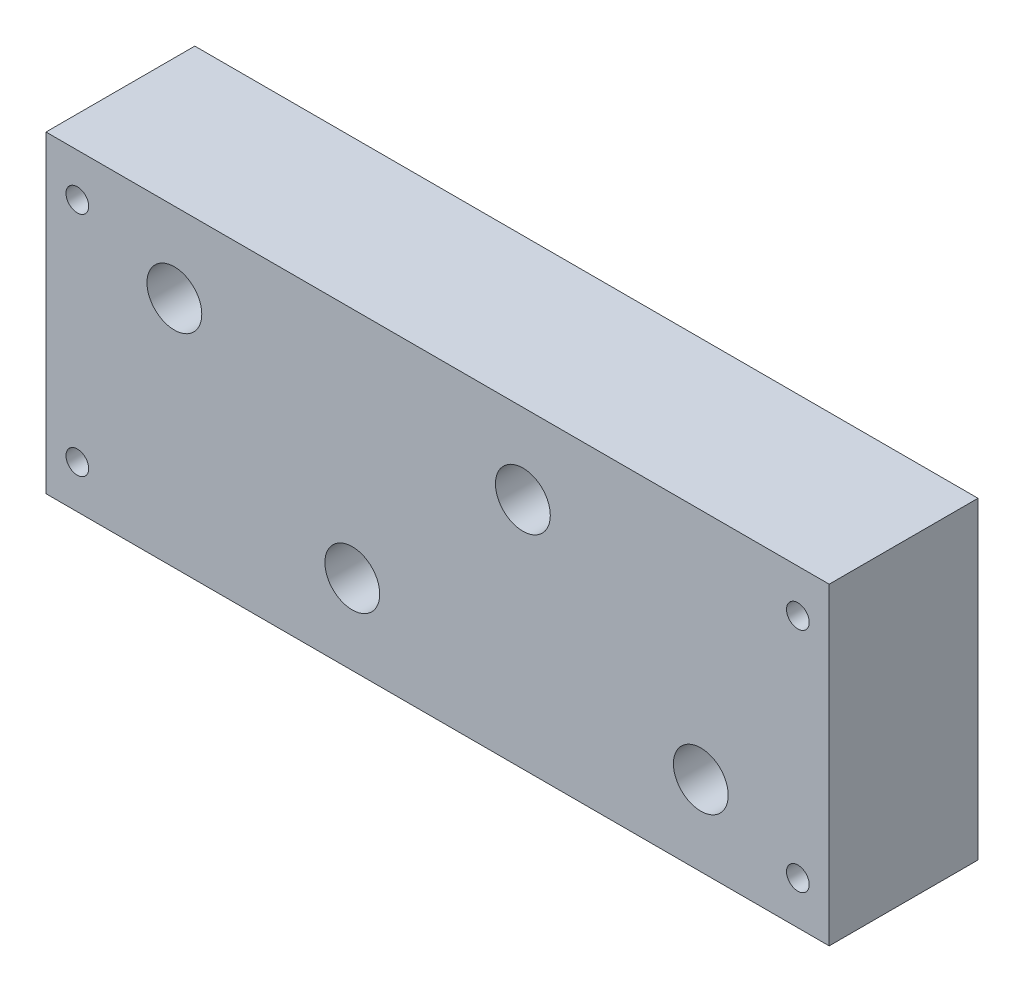
ISO-10303-21;
HEADER;
FILE_DESCRIPTION(('STEP AP214'),'2;1');
FILE_NAME('part.step','',(''),(''),'','','');
FILE_SCHEMA(('AUTOMOTIVE_DESIGN { 1 0 10303 214 1 1 1 1 }'));
ENDSEC;
DATA;
#1=APPLICATION_CONTEXT('core data for automotive mechanical design processes');
#2=APPLICATION_PROTOCOL_DEFINITION('international standard','automotive_design',2000,#1);
#3=PRODUCT_CONTEXT('',#1,'mechanical');
#4=PRODUCT('Part','Part','',(#3));
#5=PRODUCT_RELATED_PRODUCT_CATEGORY('part','',(#4));
#6=PRODUCT_DEFINITION_FORMATION('','',#4);
#7=PRODUCT_DEFINITION_CONTEXT('part definition',#1,'design');
#8=PRODUCT_DEFINITION('design','',#6,#7);
#9=PRODUCT_DEFINITION_SHAPE('','',#8);
#10=(LENGTH_UNIT() NAMED_UNIT(*) SI_UNIT(.MILLI.,.METRE.));
#11=(NAMED_UNIT(*) PLANE_ANGLE_UNIT() SI_UNIT($,.RADIAN.));
#12=(NAMED_UNIT(*) SI_UNIT($,.STERADIAN.) SOLID_ANGLE_UNIT());
#13=UNCERTAINTY_MEASURE_WITH_UNIT(LENGTH_MEASURE(1.E-05),#10,'distance_accuracy_value','');
#14=(GEOMETRIC_REPRESENTATION_CONTEXT(3) GLOBAL_UNCERTAINTY_ASSIGNED_CONTEXT((#13)) GLOBAL_UNIT_ASSIGNED_CONTEXT((#10,
#11,#12)) REPRESENTATION_CONTEXT('',''));
#15=CARTESIAN_POINT('',(0.,0.,0.));
#16=DIRECTION('',(0.,0.,1.));
#17=DIRECTION('',(1.,0.,0.));
#18=AXIS2_PLACEMENT_3D('',#15,#16,#17);
#19=CARTESIAN_POINT('',(13.75,18.5625,33.));
#20=DIRECTION('',(1.,0.,0.));
#21=DIRECTION('',(0.,1.,0.));
#22=AXIS2_PLACEMENT_3D('',#19,#20,#21);
#23=PLANE('',#22);
#24=DIRECTION('',(0.,-1.,0.));
#25=VECTOR('',#24,1.);
#26=CARTESIAN_POINT('',(13.75,18.5625,19.));
#27=LINE('',#26,#25);
#28=CARTESIAN_POINT('',(13.75,18.0625,19.));
#29=VERTEX_POINT('',#28);
#30=CARTESIAN_POINT('',(13.75,-14.9375,19.));
#31=VERTEX_POINT('',#30);
#32=EDGE_CURVE('E342',#29,#31,#27,.T.);
#33=ORIENTED_EDGE('',*,*,#32,.T.);
#34=DIRECTION('',(0.,0.,-1.));
#35=VECTOR('',#34,1.);
#36=CARTESIAN_POINT('',(13.75,-14.9375,33.));
#37=LINE('',#36,#35);
#38=CARTESIAN_POINT('',(13.75,-14.9375,33.));
#39=VERTEX_POINT('',#38);
#40=EDGE_CURVE('E211',#31,#39,#37,.F.);
#41=ORIENTED_EDGE('',*,*,#40,.T.);
#42=DIRECTION('',(0.,-1.,0.));
#43=VECTOR('',#42,1.);
#44=CARTESIAN_POINT('',(13.75,18.5625,33.));
#45=LINE('',#44,#43);
#46=CARTESIAN_POINT('',(13.75,18.0625,33.));
#47=VERTEX_POINT('',#46);
#48=EDGE_CURVE('E307',#47,#39,#45,.T.);
#49=ORIENTED_EDGE('',*,*,#48,.F.);
#50=DIRECTION('',(0.,0.,-1.));
#51=VECTOR('',#50,1.);
#52=CARTESIAN_POINT('',(13.75,18.0625,19.));
#53=LINE('',#52,#51);
#54=EDGE_CURVE('E208',#47,#29,#53,.T.);
#55=ORIENTED_EDGE('',*,*,#54,.T.);
#56=EDGE_LOOP('',(#33,#41,#49,#55));
#57=FACE_BOUND('',#56,.T.);
#58=ADVANCED_FACE('F33',(#57),#23,.F.);
#59=CARTESIAN_POINT('',(13.75,18.5625,33.));
#60=DIRECTION('',(0.,1.,0.));
#61=DIRECTION('',(0.,0.,1.));
#62=AXIS2_PLACEMENT_3D('',#59,#60,#61);
#63=PLANE('',#62);
#64=DIRECTION('',(1.,0.,0.));
#65=VECTOR('',#64,1.);
#66=CARTESIAN_POINT('',(13.75,18.5625,19.));
#67=LINE('',#66,#65);
#68=CARTESIAN_POINT('',(-25.25,18.5625,19.));
#69=VERTEX_POINT('',#68);
#70=CARTESIAN_POINT('',(13.25,18.5625,19.));
#71=VERTEX_POINT('',#70);
#72=EDGE_CURVE('E336',#69,#71,#67,.T.);
#73=ORIENTED_EDGE('',*,*,#72,.T.);
#74=DIRECTION('',(0.,0.,-1.));
#75=VECTOR('',#74,1.);
#76=CARTESIAN_POINT('',(13.25,18.5625,33.));
#77=LINE('',#76,#75);
#78=CARTESIAN_POINT('',(13.25,18.5625,33.));
#79=VERTEX_POINT('',#78);
#80=EDGE_CURVE('E224',#71,#79,#77,.F.);
#81=ORIENTED_EDGE('',*,*,#80,.T.);
#82=DIRECTION('',(1.,0.,0.));
#83=VECTOR('',#82,1.);
#84=CARTESIAN_POINT('',(13.75,18.5625,33.));
#85=LINE('',#84,#83);
#86=CARTESIAN_POINT('',(-25.25,18.5625,33.));
#87=VERTEX_POINT('',#86);
#88=EDGE_CURVE('E300',#87,#79,#85,.T.);
#89=ORIENTED_EDGE('',*,*,#88,.F.);
#90=DIRECTION('',(0.,0.,-1.));
#91=VECTOR('',#90,1.);
#92=CARTESIAN_POINT('',(-25.25,18.5625,19.));
#93=LINE('',#92,#91);
#94=EDGE_CURVE('E221',#87,#69,#93,.T.);
#95=ORIENTED_EDGE('',*,*,#94,.T.);
#96=EDGE_LOOP('',(#73,#81,#89,#95));
#97=FACE_BOUND('',#96,.T.);
#98=ADVANCED_FACE('F393',(#97),#63,.F.);
#99=CARTESIAN_POINT('',(-25.75,18.5625,33.));
#100=DIRECTION('',(-1.,0.,0.));
#101=DIRECTION('',(0.,-1.,0.));
#102=AXIS2_PLACEMENT_3D('',#99,#100,#101);
#103=PLANE('',#102);
#104=DIRECTION('',(0.,1.,0.));
#105=VECTOR('',#104,1.);
#106=CARTESIAN_POINT('',(-25.75,18.5625,19.));
#107=LINE('',#106,#105);
#108=CARTESIAN_POINT('',(-25.75,-14.9375,19.));
#109=VERTEX_POINT('',#108);
#110=CARTESIAN_POINT('',(-25.75,18.0625,19.));
#111=VERTEX_POINT('',#110);
#112=EDGE_CURVE('E333',#109,#111,#107,.T.);
#113=ORIENTED_EDGE('',*,*,#112,.T.);
#114=DIRECTION('',(0.,0.,-1.));
#115=VECTOR('',#114,1.);
#116=CARTESIAN_POINT('',(-25.75,18.0625,33.));
#117=LINE('',#116,#115);
#118=CARTESIAN_POINT('',(-25.75,18.0625,33.));
#119=VERTEX_POINT('',#118);
#120=EDGE_CURVE('E229',#111,#119,#117,.F.);
#121=ORIENTED_EDGE('',*,*,#120,.T.);
#122=DIRECTION('',(0.,1.,0.));
#123=VECTOR('',#122,1.);
#124=CARTESIAN_POINT('',(-25.75,18.5625,33.));
#125=LINE('',#124,#123);
#126=CARTESIAN_POINT('',(-25.75,-14.9375,33.));
#127=VERTEX_POINT('',#126);
#128=EDGE_CURVE('E314',#127,#119,#125,.T.);
#129=ORIENTED_EDGE('',*,*,#128,.F.);
#130=DIRECTION('',(0.,0.,-1.));
#131=VECTOR('',#130,1.);
#132=CARTESIAN_POINT('',(-25.75,-14.9375,19.));
#133=LINE('',#132,#131);
#134=EDGE_CURVE('E226',#127,#109,#133,.T.);
#135=ORIENTED_EDGE('',*,*,#134,.T.);
#136=EDGE_LOOP('',(#113,#121,#129,#135));
#137=FACE_BOUND('',#136,.T.);
#138=ADVANCED_FACE('F399',(#137),#103,.F.);
#139=CARTESIAN_POINT('',(13.75,-15.4375,33.));
#140=DIRECTION('',(0.,-1.,0.));
#141=DIRECTION('',(0.,0.,-1.));
#142=AXIS2_PLACEMENT_3D('',#139,#140,#141);
#143=PLANE('',#142);
#144=DIRECTION('',(-1.,0.,0.));
#145=VECTOR('',#144,1.);
#146=CARTESIAN_POINT('',(13.75,-15.4375,33.));
#147=LINE('',#146,#145);
#148=CARTESIAN_POINT('',(13.25,-15.4375,33.));
#149=VERTEX_POINT('',#148);
#150=CARTESIAN_POINT('',(-25.25,-15.4375,33.));
#151=VERTEX_POINT('',#150);
#152=EDGE_CURVE('E310',#149,#151,#147,.T.);
#153=ORIENTED_EDGE('',*,*,#152,.F.);
#154=DIRECTION('',(0.,0.,-1.));
#155=VECTOR('',#154,1.);
#156=CARTESIAN_POINT('',(13.25,-15.4375,19.));
#157=LINE('',#156,#155);
#158=CARTESIAN_POINT('',(13.25,-15.4375,19.));
#159=VERTEX_POINT('',#158);
#160=EDGE_CURVE('E205',#149,#159,#157,.T.);
#161=ORIENTED_EDGE('',*,*,#160,.T.);
#162=DIRECTION('',(-1.,0.,0.));
#163=VECTOR('',#162,1.);
#164=CARTESIAN_POINT('',(13.75,-15.4375,19.));
#165=LINE('',#164,#163);
#166=CARTESIAN_POINT('',(-25.25,-15.4375,19.));
#167=VERTEX_POINT('',#166);
#168=EDGE_CURVE('E194',#159,#167,#165,.T.);
#169=ORIENTED_EDGE('',*,*,#168,.T.);
#170=DIRECTION('',(0.,0.,-1.));
#171=VECTOR('',#170,1.);
#172=CARTESIAN_POINT('',(-25.25,-15.4375,33.));
#173=LINE('',#172,#171);
#174=EDGE_CURVE('E198',#167,#151,#173,.F.);
#175=ORIENTED_EDGE('',*,*,#174,.T.);
#176=EDGE_LOOP('',(#153,#161,#169,#175));
#177=FACE_BOUND('',#176,.T.);
#178=ADVANCED_FACE('F403',(#177),#143,.F.);
#179=CARTESIAN_POINT('',(0.,0.,33.));
#180=DIRECTION('',(0.,0.,-1.));
#181=DIRECTION('',(-1.,0.,0.));
#182=AXIS2_PLACEMENT_3D('',#179,#180,#181);
#183=PLANE('',#182);
#184=CARTESIAN_POINT('',(5.36038806849447,-8.23247743403263,33.));
#185=DIRECTION('',(0.,0.,-1.));
#186=DIRECTION('',(-1.,0.,0.));
#187=AXIS2_PLACEMENT_3D('',#184,#185,#186);
#188=CIRCLE('',#187,3.5);
#189=CARTESIAN_POINT('',(1.86038806849447,-8.23247743403263,33.));
#190=VERTEX_POINT('',#189);
#191=EDGE_CURVE('E646',#190,#190,#188,.T.);
#192=ORIENTED_EDGE('',*,*,#191,.F.);
#193=EDGE_LOOP('',(#192));
#194=FACE_BOUND('',#193,.T.);
#195=CARTESIAN_POINT('',(-17.3603880684945,11.3574774340326,33.));
#196=DIRECTION('',(0.,0.,-1.));
#197=DIRECTION('',(-1.,0.,0.));
#198=AXIS2_PLACEMENT_3D('',#195,#196,#197);
#199=CIRCLE('',#198,3.50000000000001);
#200=CARTESIAN_POINT('',(-20.8603880684945,11.3574774340326,33.));
#201=VERTEX_POINT('',#200);
#202=EDGE_CURVE('E652',#201,#201,#199,.T.);
#203=ORIENTED_EDGE('',*,*,#202,.F.);
#204=EDGE_LOOP('',(#203));
#205=FACE_BOUND('',#204,.T.);
#206=ORIENTED_EDGE('',*,*,#48,.T.);
#207=CARTESIAN_POINT('',(13.25,-14.9375,33.));
#208=DIRECTION('',(0.,0.,-1.));
#209=DIRECTION('',(-1.,0.,0.));
#210=AXIS2_PLACEMENT_3D('',#207,#208,#209);
#211=CIRCLE('',#210,0.5);
#212=EDGE_CURVE('E219',#39,#149,#211,.T.);
#213=ORIENTED_EDGE('',*,*,#212,.T.);
#214=ORIENTED_EDGE('',*,*,#152,.T.);
#215=CARTESIAN_POINT('',(-25.25,-14.9375,33.));
#216=DIRECTION('',(0.,0.,-1.));
#217=DIRECTION('',(-1.,0.,0.));
#218=AXIS2_PLACEMENT_3D('',#215,#216,#217);
#219=CIRCLE('',#218,0.5);
#220=EDGE_CURVE('E213',#151,#127,#219,.T.);
#221=ORIENTED_EDGE('',*,*,#220,.T.);
#222=ORIENTED_EDGE('',*,*,#128,.T.);
#223=CARTESIAN_POINT('',(-25.25,18.0625,33.));
#224=DIRECTION('',(0.,0.,-1.));
#225=DIRECTION('',(-1.,0.,0.));
#226=AXIS2_PLACEMENT_3D('',#223,#224,#225);
#227=CIRCLE('',#226,0.5);
#228=EDGE_CURVE('E215',#119,#87,#227,.T.);
#229=ORIENTED_EDGE('',*,*,#228,.T.);
#230=ORIENTED_EDGE('',*,*,#88,.T.);
#231=CARTESIAN_POINT('',(13.25,18.0625,33.));
#232=DIRECTION('',(0.,0.,-1.));
#233=DIRECTION('',(-1.,0.,0.));
#234=AXIS2_PLACEMENT_3D('',#231,#232,#233);
#235=CIRCLE('',#234,0.5);
#236=EDGE_CURVE('E217',#79,#47,#235,.T.);
#237=ORIENTED_EDGE('',*,*,#236,.T.);
#238=EDGE_LOOP('',(#206,#213,#214,#221,#222,#229,#230,#237));
#239=FACE_BOUND('',#238,.T.);
#240=ADVANCED_FACE('F473',(#194,#205,#239),#183,.T.);
#241=CARTESIAN_POINT('',(66.25,-18.4375,19.));
#242=DIRECTION('',(0.,0.,1.));
#243=DIRECTION('',(1.,0.,0.));
#244=AXIS2_PLACEMENT_3D('',#241,#242,#243);
#245=PLANE('',#244);
#246=CARTESIAN_POINT('',(-29.75,-12.9375,19.));
#247=DIRECTION('',(0.,0.,1.));
#248=DIRECTION('',(1.,0.,0.));
#249=AXIS2_PLACEMENT_3D('',#246,#247,#248);
#250=CIRCLE('',#249,1.45);
#251=CARTESIAN_POINT('',(-28.3,-12.9375,19.));
#252=VERTEX_POINT('',#251);
#253=EDGE_CURVE('E356',#252,#252,#250,.F.);
#254=ORIENTED_EDGE('',*,*,#253,.F.);
#255=EDGE_LOOP('',(#254));
#256=FACE_BOUND('',#255,.T.);
#257=CARTESIAN_POINT('',(62.25,-12.9375,19.));
#258=DIRECTION('',(0.,0.,1.));
#259=DIRECTION('',(1.,0.,0.));
#260=AXIS2_PLACEMENT_3D('',#257,#258,#259);
#261=CIRCLE('',#260,1.45);
#262=CARTESIAN_POINT('',(63.7,-12.9375,19.));
#263=VERTEX_POINT('',#262);
#264=EDGE_CURVE('E280',#263,#263,#261,.F.);
#265=ORIENTED_EDGE('',*,*,#264,.F.);
#266=EDGE_LOOP('',(#265));
#267=FACE_BOUND('',#266,.T.);
#268=DIRECTION('',(1.,0.,0.));
#269=VECTOR('',#268,1.);
#270=CARTESIAN_POINT('',(66.25,21.5625,19.));
#271=LINE('',#270,#269);
#272=CARTESIAN_POINT('',(-33.75,21.5625,19.));
#273=VERTEX_POINT('',#272);
#274=CARTESIAN_POINT('',(66.25,21.5625,19.));
#275=VERTEX_POINT('',#274);
#276=EDGE_CURVE('E180',#273,#275,#271,.T.);
#277=ORIENTED_EDGE('',*,*,#276,.T.);
#278=DIRECTION('',(0.,1.,0.));
#279=VECTOR('',#278,1.);
#280=CARTESIAN_POINT('',(66.25,-18.4375,19.));
#281=LINE('',#280,#279);
#282=CARTESIAN_POINT('',(66.25,-18.4375,19.));
#283=VERTEX_POINT('',#282);
#284=EDGE_CURVE('E175',#283,#275,#281,.T.);
#285=ORIENTED_EDGE('',*,*,#284,.F.);
#286=DIRECTION('',(1.,0.,0.));
#287=VECTOR('',#286,1.);
#288=CARTESIAN_POINT('',(66.25,-18.4375,19.));
#289=LINE('',#288,#287);
#290=CARTESIAN_POINT('',(-33.75,-18.4375,19.));
#291=VERTEX_POINT('',#290);
#292=EDGE_CURVE('E168',#291,#283,#289,.T.);
#293=ORIENTED_EDGE('',*,*,#292,.F.);
#294=DIRECTION('',(0.,1.,0.));
#295=VECTOR('',#294,1.);
#296=CARTESIAN_POINT('',(-33.75,-18.4375,19.));
#297=LINE('',#296,#295);
#298=EDGE_CURVE('E172',#291,#273,#297,.T.);
#299=ORIENTED_EDGE('',*,*,#298,.T.);
#300=EDGE_LOOP('',(#277,#285,#293,#299));
#301=FACE_BOUND('',#300,.T.);
#302=ORIENTED_EDGE('',*,*,#72,.F.);
#303=CARTESIAN_POINT('',(-25.25,18.0625,19.));
#304=DIRECTION('',(0.,0.,1.));
#305=DIRECTION('',(1.,0.,0.));
#306=AXIS2_PLACEMENT_3D('',#303,#304,#305);
#307=CIRCLE('',#306,0.5);
#308=EDGE_CURVE('E262',#69,#111,#307,.T.);
#309=ORIENTED_EDGE('',*,*,#308,.T.);
#310=ORIENTED_EDGE('',*,*,#112,.F.);
#311=CARTESIAN_POINT('',(-25.25,-14.9375,19.));
#312=DIRECTION('',(0.,0.,1.));
#313=DIRECTION('',(1.,0.,0.));
#314=AXIS2_PLACEMENT_3D('',#311,#312,#313);
#315=CIRCLE('',#314,0.5);
#316=EDGE_CURVE('E264',#109,#167,#315,.T.);
#317=ORIENTED_EDGE('',*,*,#316,.T.);
#318=ORIENTED_EDGE('',*,*,#168,.F.);
#319=CARTESIAN_POINT('',(13.25,-14.9375,19.));
#320=DIRECTION('',(0.,0.,1.));
#321=DIRECTION('',(1.,0.,0.));
#322=AXIS2_PLACEMENT_3D('',#319,#320,#321);
#323=CIRCLE('',#322,0.5);
#324=EDGE_CURVE('E258',#159,#31,#323,.T.);
#325=ORIENTED_EDGE('',*,*,#324,.T.);
#326=ORIENTED_EDGE('',*,*,#32,.F.);
#327=CARTESIAN_POINT('',(13.25,18.0625,19.));
#328=DIRECTION('',(0.,0.,1.));
#329=DIRECTION('',(1.,0.,0.));
#330=AXIS2_PLACEMENT_3D('',#327,#328,#329);
#331=CIRCLE('',#330,0.5);
#332=EDGE_CURVE('E260',#29,#71,#331,.T.);
#333=ORIENTED_EDGE('',*,*,#332,.T.);
#334=EDGE_LOOP('',(#302,#309,#310,#317,#318,#325,#326,#333));
#335=FACE_BOUND('',#334,.T.);
#336=DIRECTION('',(1.,0.,0.));
#337=VECTOR('',#336,1.);
#338=CARTESIAN_POINT('',(58.25,18.5625,19.));
#339=LINE('',#338,#337);
#340=CARTESIAN_POINT('',(19.25,18.5625,19.));
#341=VERTEX_POINT('',#340);
#342=CARTESIAN_POINT('',(57.75,18.5625,19.));
#343=VERTEX_POINT('',#342);
#344=EDGE_CURVE('E281',#341,#343,#339,.T.);
#345=ORIENTED_EDGE('',*,*,#344,.F.);
#346=CARTESIAN_POINT('',(19.25,18.0625,19.));
#347=DIRECTION('',(0.,0.,1.));
#348=DIRECTION('',(1.,0.,0.));
#349=AXIS2_PLACEMENT_3D('',#346,#347,#348);
#350=CIRCLE('',#349,0.5);
#351=CARTESIAN_POINT('',(18.75,18.0625,19.));
#352=VERTEX_POINT('',#351);
#353=EDGE_CURVE('E266',#341,#352,#350,.T.);
#354=ORIENTED_EDGE('',*,*,#353,.T.);
#355=DIRECTION('',(0.,1.,0.));
#356=VECTOR('',#355,1.);
#357=CARTESIAN_POINT('',(18.75,18.5625,19.));
#358=LINE('',#357,#356);
#359=CARTESIAN_POINT('',(18.75,-14.9375,19.));
#360=VERTEX_POINT('',#359);
#361=EDGE_CURVE('E346',#360,#352,#358,.T.);
#362=ORIENTED_EDGE('',*,*,#361,.F.);
#363=CARTESIAN_POINT('',(19.25,-14.9375,19.));
#364=DIRECTION('',(0.,0.,1.));
#365=DIRECTION('',(1.,0.,0.));
#366=AXIS2_PLACEMENT_3D('',#363,#364,#365);
#367=CIRCLE('',#366,0.5);
#368=CARTESIAN_POINT('',(19.25,-15.4375,19.));
#369=VERTEX_POINT('',#368);
#370=EDGE_CURVE('E11',#360,#369,#367,.T.);
#371=ORIENTED_EDGE('',*,*,#370,.T.);
#372=DIRECTION('',(-1.,0.,0.));
#373=VECTOR('',#372,1.);
#374=CARTESIAN_POINT('',(58.25,-15.4375,19.));
#375=LINE('',#374,#373);
#376=CARTESIAN_POINT('',(57.75,-15.4375,19.));
#377=VERTEX_POINT('',#376);
#378=EDGE_CURVE('E274',#377,#369,#375,.T.);
#379=ORIENTED_EDGE('',*,*,#378,.F.);
#380=CARTESIAN_POINT('',(57.75,-14.9375,19.));
#381=DIRECTION('',(0.,0.,1.));
#382=DIRECTION('',(1.,0.,0.));
#383=AXIS2_PLACEMENT_3D('',#380,#381,#382);
#384=CIRCLE('',#383,0.5);
#385=CARTESIAN_POINT('',(58.25,-14.9375,19.));
#386=VERTEX_POINT('',#385);
#387=EDGE_CURVE('E41',#377,#386,#384,.T.);
#388=ORIENTED_EDGE('',*,*,#387,.T.);
#389=DIRECTION('',(0.,-1.,0.));
#390=VECTOR('',#389,1.);
#391=CARTESIAN_POINT('',(58.25,18.5625,19.));
#392=LINE('',#391,#390);
#393=CARTESIAN_POINT('',(58.25,18.0625,19.));
#394=VERTEX_POINT('',#393);
#395=EDGE_CURVE('E273',#394,#386,#392,.T.);
#396=ORIENTED_EDGE('',*,*,#395,.F.);
#397=CARTESIAN_POINT('',(57.75,18.0625,19.));
#398=DIRECTION('',(0.,0.,1.));
#399=DIRECTION('',(1.,0.,0.));
#400=AXIS2_PLACEMENT_3D('',#397,#398,#399);
#401=CIRCLE('',#400,0.5);
#402=EDGE_CURVE('E268',#394,#343,#401,.T.);
#403=ORIENTED_EDGE('',*,*,#402,.T.);
#404=EDGE_LOOP('',(#345,#354,#362,#371,#379,#388,#396,#403));
#405=FACE_BOUND('',#404,.T.);
#406=CARTESIAN_POINT('',(-29.75,16.0625,19.));
#407=DIRECTION('',(0.,0.,1.));
#408=DIRECTION('',(1.,0.,0.));
#409=AXIS2_PLACEMENT_3D('',#406,#407,#408);
#410=CIRCLE('',#409,1.45);
#411=CARTESIAN_POINT('',(-28.3,16.0625,19.));
#412=VERTEX_POINT('',#411);
#413=EDGE_CURVE('E353',#412,#412,#410,.F.);
#414=ORIENTED_EDGE('',*,*,#413,.F.);
#415=EDGE_LOOP('',(#414));
#416=FACE_BOUND('',#415,.T.);
#417=CARTESIAN_POINT('',(62.25,16.0625,19.));
#418=DIRECTION('',(0.,0.,1.));
#419=DIRECTION('',(1.,0.,0.));
#420=AXIS2_PLACEMENT_3D('',#417,#418,#419);
#421=CIRCLE('',#420,1.45);
#422=CARTESIAN_POINT('',(63.7,16.0625,19.));
#423=VERTEX_POINT('',#422);
#424=EDGE_CURVE('E359',#423,#423,#421,.F.);
#425=ORIENTED_EDGE('',*,*,#424,.F.);
#426=EDGE_LOOP('',(#425));
#427=FACE_BOUND('',#426,.T.);
#428=ADVANCED_FACE('F170',(#256,#267,#301,#335,#405,#416,#427),#245,.F.);
#429=CARTESIAN_POINT('',(58.25,18.5625,33.));
#430=DIRECTION('',(1.,0.,0.));
#431=DIRECTION('',(0.,1.,0.));
#432=AXIS2_PLACEMENT_3D('',#429,#430,#431);
#433=PLANE('',#432);
#434=DIRECTION('',(0.,-1.,0.));
#435=VECTOR('',#434,1.);
#436=CARTESIAN_POINT('',(58.25,18.5625,33.));
#437=LINE('',#436,#435);
#438=CARTESIAN_POINT('',(58.25,18.0625,33.));
#439=VERTEX_POINT('',#438);
#440=CARTESIAN_POINT('',(58.25,-14.9375,33.));
#441=VERTEX_POINT('',#440);
#442=EDGE_CURVE('E292',#439,#441,#437,.T.);
#443=ORIENTED_EDGE('',*,*,#442,.F.);
#444=DIRECTION('',(0.,0.,-1.));
#445=VECTOR('',#444,1.);
#446=CARTESIAN_POINT('',(58.25,18.0625,19.));
#447=LINE('',#446,#445);
#448=EDGE_CURVE('E251',#439,#394,#447,.T.);
#449=ORIENTED_EDGE('',*,*,#448,.T.);
#450=ORIENTED_EDGE('',*,*,#395,.T.);
#451=DIRECTION('',(0.,0.,-1.));
#452=VECTOR('',#451,1.);
#453=CARTESIAN_POINT('',(58.25,-14.9375,33.));
#454=LINE('',#453,#452);
#455=EDGE_CURVE('E249',#386,#441,#454,.F.);
#456=ORIENTED_EDGE('',*,*,#455,.T.);
#457=EDGE_LOOP('',(#443,#449,#450,#456));
#458=FACE_BOUND('',#457,.T.);
#459=ADVANCED_FACE('F277',(#458),#433,.F.);
#460=CARTESIAN_POINT('',(58.25,18.5625,33.));
#461=DIRECTION('',(0.,1.,0.));
#462=DIRECTION('',(0.,0.,1.));
#463=AXIS2_PLACEMENT_3D('',#460,#461,#462);
#464=PLANE('',#463);
#465=DIRECTION('',(1.,0.,0.));
#466=VECTOR('',#465,1.);
#467=CARTESIAN_POINT('',(58.25,18.5625,33.));
#468=LINE('',#467,#466);
#469=CARTESIAN_POINT('',(19.25,18.5625,33.));
#470=VERTEX_POINT('',#469);
#471=CARTESIAN_POINT('',(57.75,18.5625,33.));
#472=VERTEX_POINT('',#471);
#473=EDGE_CURVE('E298',#470,#472,#468,.T.);
#474=ORIENTED_EDGE('',*,*,#473,.F.);
#475=DIRECTION('',(0.,0.,-1.));
#476=VECTOR('',#475,1.);
#477=CARTESIAN_POINT('',(19.25,18.5625,19.));
#478=LINE('',#477,#476);
#479=EDGE_CURVE('E233',#470,#341,#478,.T.);
#480=ORIENTED_EDGE('',*,*,#479,.T.);
#481=ORIENTED_EDGE('',*,*,#344,.T.);
#482=DIRECTION('',(0.,0.,-1.));
#483=VECTOR('',#482,1.);
#484=CARTESIAN_POINT('',(57.75,18.5625,33.));
#485=LINE('',#484,#483);
#486=EDGE_CURVE('E231',#343,#472,#485,.F.);
#487=ORIENTED_EDGE('',*,*,#486,.T.);
#488=EDGE_LOOP('',(#474,#480,#481,#487));
#489=FACE_BOUND('',#488,.T.);
#490=ADVANCED_FACE('F460',(#489),#464,.F.);
#491=CARTESIAN_POINT('',(18.75,18.5625,33.));
#492=DIRECTION('',(-1.,0.,0.));
#493=DIRECTION('',(0.,-1.,0.));
#494=AXIS2_PLACEMENT_3D('',#491,#492,#493);
#495=PLANE('',#494);
#496=ORIENTED_EDGE('',*,*,#361,.T.);
#497=DIRECTION('',(0.,0.,-1.));
#498=VECTOR('',#497,1.);
#499=CARTESIAN_POINT('',(18.75,18.0625,33.));
#500=LINE('',#499,#498);
#501=CARTESIAN_POINT('',(18.75,18.0625,33.));
#502=VERTEX_POINT('',#501);
#503=EDGE_CURVE('E239',#352,#502,#500,.F.);
#504=ORIENTED_EDGE('',*,*,#503,.T.);
#505=DIRECTION('',(0.,1.,0.));
#506=VECTOR('',#505,1.);
#507=CARTESIAN_POINT('',(18.75,18.5625,33.));
#508=LINE('',#507,#506);
#509=CARTESIAN_POINT('',(18.75,-14.9375,33.));
#510=VERTEX_POINT('',#509);
#511=EDGE_CURVE('E296',#510,#502,#508,.T.);
#512=ORIENTED_EDGE('',*,*,#511,.F.);
#513=DIRECTION('',(0.,0.,-1.));
#514=VECTOR('',#513,1.);
#515=CARTESIAN_POINT('',(18.75,-14.9375,19.));
#516=LINE('',#515,#514);
#517=EDGE_CURVE('E236',#510,#360,#516,.T.);
#518=ORIENTED_EDGE('',*,*,#517,.T.);
#519=EDGE_LOOP('',(#496,#504,#512,#518));
#520=FACE_BOUND('',#519,.T.);
#521=ADVANCED_FACE('F454',(#520),#495,.F.);
#522=CARTESIAN_POINT('',(58.25,-15.4375,33.));
#523=DIRECTION('',(0.,-1.,0.));
#524=DIRECTION('',(0.,0.,-1.));
#525=AXIS2_PLACEMENT_3D('',#522,#523,#524);
#526=PLANE('',#525);
#527=DIRECTION('',(-1.,0.,0.));
#528=VECTOR('',#527,1.);
#529=CARTESIAN_POINT('',(58.25,-15.4375,33.));
#530=LINE('',#529,#528);
#531=CARTESIAN_POINT('',(57.75,-15.4375,33.));
#532=VERTEX_POINT('',#531);
#533=CARTESIAN_POINT('',(19.25,-15.4375,33.));
#534=VERTEX_POINT('',#533);
#535=EDGE_CURVE('E290',#532,#534,#530,.T.);
#536=ORIENTED_EDGE('',*,*,#535,.F.);
#537=DIRECTION('',(0.,0.,-1.));
#538=VECTOR('',#537,1.);
#539=CARTESIAN_POINT('',(57.75,-15.4375,19.));
#540=LINE('',#539,#538);
#541=EDGE_CURVE('E256',#532,#377,#540,.T.);
#542=ORIENTED_EDGE('',*,*,#541,.T.);
#543=ORIENTED_EDGE('',*,*,#378,.T.);
#544=DIRECTION('',(0.,0.,-1.));
#545=VECTOR('',#544,1.);
#546=CARTESIAN_POINT('',(19.25,-15.4375,33.));
#547=LINE('',#546,#545);
#548=EDGE_CURVE('E254',#369,#534,#547,.F.);
#549=ORIENTED_EDGE('',*,*,#548,.T.);
#550=EDGE_LOOP('',(#536,#542,#543,#549));
#551=FACE_BOUND('',#550,.T.);
#552=ADVANCED_FACE('F294',(#551),#526,.F.);
#553=CARTESIAN_POINT('',(0.,0.,33.));
#554=DIRECTION('',(0.,0.,-1.));
#555=DIRECTION('',(-1.,0.,0.));
#556=AXIS2_PLACEMENT_3D('',#553,#554,#555);
#557=PLANE('',#556);
#558=CARTESIAN_POINT('',(49.8603880684945,-8.23247743403263,33.));
#559=DIRECTION('',(0.,0.,-1.));
#560=DIRECTION('',(-1.,0.,0.));
#561=AXIS2_PLACEMENT_3D('',#558,#559,#560);
#562=CIRCLE('',#561,3.5);
#563=CARTESIAN_POINT('',(46.3603880684945,-8.23247743403263,33.));
#564=VERTEX_POINT('',#563);
#565=EDGE_CURVE('E636',#564,#564,#562,.T.);
#566=ORIENTED_EDGE('',*,*,#565,.F.);
#567=EDGE_LOOP('',(#566));
#568=FACE_BOUND('',#567,.T.);
#569=CARTESIAN_POINT('',(27.1396119315055,11.3574774340326,33.));
#570=DIRECTION('',(0.,0.,-1.));
#571=DIRECTION('',(-1.,0.,0.));
#572=AXIS2_PLACEMENT_3D('',#569,#570,#571);
#573=CIRCLE('',#572,3.5);
#574=CARTESIAN_POINT('',(23.6396119315055,11.3574774340326,33.));
#575=VERTEX_POINT('',#574);
#576=EDGE_CURVE('E638',#575,#575,#573,.T.);
#577=ORIENTED_EDGE('',*,*,#576,.F.);
#578=EDGE_LOOP('',(#577));
#579=FACE_BOUND('',#578,.T.);
#580=ORIENTED_EDGE('',*,*,#511,.T.);
#581=CARTESIAN_POINT('',(19.25,18.0625,33.));
#582=DIRECTION('',(0.,0.,-1.));
#583=DIRECTION('',(-1.,0.,0.));
#584=AXIS2_PLACEMENT_3D('',#581,#582,#583);
#585=CIRCLE('',#584,0.5);
#586=EDGE_CURVE('E247',#502,#470,#585,.T.);
#587=ORIENTED_EDGE('',*,*,#586,.T.);
#588=ORIENTED_EDGE('',*,*,#473,.T.);
#589=CARTESIAN_POINT('',(57.75,18.0625,33.));
#590=DIRECTION('',(0.,0.,-1.));
#591=DIRECTION('',(-1.,0.,0.));
#592=AXIS2_PLACEMENT_3D('',#589,#590,#591);
#593=CIRCLE('',#592,0.5);
#594=EDGE_CURVE('E245',#472,#439,#593,.T.);
#595=ORIENTED_EDGE('',*,*,#594,.T.);
#596=ORIENTED_EDGE('',*,*,#442,.T.);
#597=CARTESIAN_POINT('',(57.75,-14.9375,33.));
#598=DIRECTION('',(0.,0.,-1.));
#599=DIRECTION('',(-1.,0.,0.));
#600=AXIS2_PLACEMENT_3D('',#597,#598,#599);
#601=CIRCLE('',#600,0.5);
#602=EDGE_CURVE('E243',#441,#532,#601,.T.);
#603=ORIENTED_EDGE('',*,*,#602,.T.);
#604=ORIENTED_EDGE('',*,*,#535,.T.);
#605=CARTESIAN_POINT('',(19.25,-14.9375,33.));
#606=DIRECTION('',(0.,0.,-1.));
#607=DIRECTION('',(-1.,0.,0.));
#608=AXIS2_PLACEMENT_3D('',#605,#606,#607);
#609=CIRCLE('',#608,0.5);
#610=EDGE_CURVE('E241',#534,#510,#609,.T.);
#611=ORIENTED_EDGE('',*,*,#610,.T.);
#612=EDGE_LOOP('',(#580,#587,#588,#595,#596,#603,#604,#611));
#613=FACE_BOUND('',#612,.T.);
#614=ADVANCED_FACE('F289',(#568,#579,#613),#557,.T.);
#615=CARTESIAN_POINT('',(-33.75,21.5625,38.));
#616=DIRECTION('',(1.,0.,0.));
#617=DIRECTION('',(0.,0.,-1.));
#618=AXIS2_PLACEMENT_3D('',#615,#616,#617);
#619=PLANE('',#618);
#620=DIRECTION('',(0.,0.,-1.));
#621=VECTOR('',#620,1.);
#622=CARTESIAN_POINT('',(-33.75,21.5625,38.));
#623=LINE('',#622,#621);
#624=CARTESIAN_POINT('',(-33.75,21.5625,38.));
#625=VERTEX_POINT('',#624);
#626=EDGE_CURVE('E189',#625,#273,#623,.T.);
#627=ORIENTED_EDGE('',*,*,#626,.T.);
#628=ORIENTED_EDGE('',*,*,#298,.F.);
#629=DIRECTION('',(0.,0.,-1.));
#630=VECTOR('',#629,1.);
#631=CARTESIAN_POINT('',(-33.75,-18.4375,38.));
#632=LINE('',#631,#630);
#633=CARTESIAN_POINT('',(-33.75,-18.4375,38.));
#634=VERTEX_POINT('',#633);
#635=EDGE_CURVE('E187',#634,#291,#632,.T.);
#636=ORIENTED_EDGE('',*,*,#635,.F.);
#637=DIRECTION('',(0.,-1.,0.));
#638=VECTOR('',#637,1.);
#639=CARTESIAN_POINT('',(-33.75,21.5625,38.));
#640=LINE('',#639,#638);
#641=EDGE_CURVE('E306',#625,#634,#640,.T.);
#642=ORIENTED_EDGE('',*,*,#641,.F.);
#643=EDGE_LOOP('',(#627,#628,#636,#642));
#644=FACE_BOUND('',#643,.T.);
#645=ADVANCED_FACE('F185',(#644),#619,.F.);
#646=CARTESIAN_POINT('',(-33.75,-18.4375,38.));
#647=DIRECTION('',(0.,1.,0.));
#648=DIRECTION('',(0.,0.,1.));
#649=AXIS2_PLACEMENT_3D('',#646,#647,#648);
#650=PLANE('',#649);
#651=ORIENTED_EDGE('',*,*,#635,.T.);
#652=ORIENTED_EDGE('',*,*,#292,.T.);
#653=DIRECTION('',(0.,0.,-1.));
#654=VECTOR('',#653,1.);
#655=CARTESIAN_POINT('',(66.25,-18.4375,38.));
#656=LINE('',#655,#654);
#657=CARTESIAN_POINT('',(66.25,-18.4375,38.));
#658=VERTEX_POINT('',#657);
#659=EDGE_CURVE('E195',#658,#283,#656,.T.);
#660=ORIENTED_EDGE('',*,*,#659,.F.);
#661=DIRECTION('',(1.,0.,0.));
#662=VECTOR('',#661,1.);
#663=CARTESIAN_POINT('',(-33.75,-18.4375,38.));
#664=LINE('',#663,#662);
#665=EDGE_CURVE('E192',#634,#658,#664,.T.);
#666=ORIENTED_EDGE('',*,*,#665,.F.);
#667=EDGE_LOOP('',(#651,#652,#660,#666));
#668=FACE_BOUND('',#667,.T.);
#669=ADVANCED_FACE('F191',(#668),#650,.F.);
#670=CARTESIAN_POINT('',(66.25,21.5625,38.));
#671=DIRECTION('',(-1.,0.,0.));
#672=DIRECTION('',(0.,0.,1.));
#673=AXIS2_PLACEMENT_3D('',#670,#671,#672);
#674=PLANE('',#673);
#675=ORIENTED_EDGE('',*,*,#659,.T.);
#676=ORIENTED_EDGE('',*,*,#284,.T.);
#677=DIRECTION('',(0.,0.,-1.));
#678=VECTOR('',#677,1.);
#679=CARTESIAN_POINT('',(66.25,21.5625,38.));
#680=LINE('',#679,#678);
#681=CARTESIAN_POINT('',(66.25,21.5625,38.));
#682=VERTEX_POINT('',#681);
#683=EDGE_CURVE('E200',#682,#275,#680,.T.);
#684=ORIENTED_EDGE('',*,*,#683,.F.);
#685=DIRECTION('',(0.,1.,0.));
#686=VECTOR('',#685,1.);
#687=CARTESIAN_POINT('',(66.25,21.5625,38.));
#688=LINE('',#687,#686);
#689=EDGE_CURVE('E321',#658,#682,#688,.T.);
#690=ORIENTED_EDGE('',*,*,#689,.F.);
#691=EDGE_LOOP('',(#675,#676,#684,#690));
#692=FACE_BOUND('',#691,.T.);
#693=ADVANCED_FACE('F332',(#692),#674,.F.);
#694=CARTESIAN_POINT('',(-33.75,21.5625,38.));
#695=DIRECTION('',(0.,-1.,0.));
#696=DIRECTION('',(0.,0.,-1.));
#697=AXIS2_PLACEMENT_3D('',#694,#695,#696);
#698=PLANE('',#697);
#699=ORIENTED_EDGE('',*,*,#683,.T.);
#700=ORIENTED_EDGE('',*,*,#276,.F.);
#701=ORIENTED_EDGE('',*,*,#626,.F.);
#702=DIRECTION('',(-1.,0.,0.));
#703=VECTOR('',#702,1.);
#704=CARTESIAN_POINT('',(-33.75,21.5625,38.));
#705=LINE('',#704,#703);
#706=EDGE_CURVE('E323',#682,#625,#705,.T.);
#707=ORIENTED_EDGE('',*,*,#706,.F.);
#708=EDGE_LOOP('',(#699,#700,#701,#707));
#709=FACE_BOUND('',#708,.T.);
#710=ADVANCED_FACE('F329',(#709),#698,.F.);
#711=CARTESIAN_POINT('',(0.,0.,38.));
#712=DIRECTION('',(0.,0.,1.));
#713=DIRECTION('',(1.,0.,0.));
#714=AXIS2_PLACEMENT_3D('',#711,#712,#713);
#715=PLANE('',#714);
#716=CARTESIAN_POINT('',(49.8603880684945,-8.23247743403263,38.));
#717=DIRECTION('',(0.,0.,1.));
#718=DIRECTION('',(1.,0.,0.));
#719=AXIS2_PLACEMENT_3D('',#716,#717,#718);
#720=CIRCLE('',#719,3.5);
#721=CARTESIAN_POINT('',(53.3603880684945,-8.23247743403263,38.));
#722=VERTEX_POINT('',#721);
#723=EDGE_CURVE('E633',#722,#722,#720,.F.);
#724=ORIENTED_EDGE('',*,*,#723,.T.);
#725=EDGE_LOOP('',(#724));
#726=FACE_BOUND('',#725,.T.);
#727=CARTESIAN_POINT('',(27.1396119315055,11.3574774340326,38.));
#728=DIRECTION('',(0.,0.,1.));
#729=DIRECTION('',(1.,0.,0.));
#730=AXIS2_PLACEMENT_3D('',#727,#728,#729);
#731=CIRCLE('',#730,3.5);
#732=CARTESIAN_POINT('',(30.6396119315055,11.3574774340326,38.));
#733=VERTEX_POINT('',#732);
#734=EDGE_CURVE('E643',#733,#733,#731,.F.);
#735=ORIENTED_EDGE('',*,*,#734,.T.);
#736=EDGE_LOOP('',(#735));
#737=FACE_BOUND('',#736,.T.);
#738=CARTESIAN_POINT('',(5.36038806849447,-8.23247743403263,38.));
#739=DIRECTION('',(0.,0.,1.));
#740=DIRECTION('',(1.,0.,0.));
#741=AXIS2_PLACEMENT_3D('',#738,#739,#740);
#742=CIRCLE('',#741,3.5);
#743=CARTESIAN_POINT('',(8.86038806849447,-8.23247743403263,38.));
#744=VERTEX_POINT('',#743);
#745=EDGE_CURVE('E649',#744,#744,#742,.F.);
#746=ORIENTED_EDGE('',*,*,#745,.T.);
#747=EDGE_LOOP('',(#746));
#748=FACE_BOUND('',#747,.T.);
#749=CARTESIAN_POINT('',(-17.3603880684945,11.3574774340326,38.));
#750=DIRECTION('',(0.,0.,1.));
#751=DIRECTION('',(1.,0.,0.));
#752=AXIS2_PLACEMENT_3D('',#749,#750,#751);
#753=CIRCLE('',#752,3.50000000000001);
#754=CARTESIAN_POINT('',(-13.8603880684945,11.3574774340326,38.));
#755=VERTEX_POINT('',#754);
#756=EDGE_CURVE('E655',#755,#755,#753,.F.);
#757=ORIENTED_EDGE('',*,*,#756,.T.);
#758=EDGE_LOOP('',(#757));
#759=FACE_BOUND('',#758,.T.);
#760=CARTESIAN_POINT('',(62.25,-12.9375,38.));
#761=DIRECTION('',(0.,0.,1.));
#762=DIRECTION('',(1.,0.,0.));
#763=AXIS2_PLACEMENT_3D('',#760,#761,#762);
#764=CIRCLE('',#763,1.45);
#765=CARTESIAN_POINT('',(63.7,-12.9375,38.));
#766=VERTEX_POINT('',#765);
#767=EDGE_CURVE('E366',#766,#766,#764,.F.);
#768=ORIENTED_EDGE('',*,*,#767,.T.);
#769=EDGE_LOOP('',(#768));
#770=FACE_BOUND('',#769,.T.);
#771=CARTESIAN_POINT('',(-29.75,16.0625,38.));
#772=DIRECTION('',(0.,0.,1.));
#773=DIRECTION('',(1.,0.,0.));
#774=AXIS2_PLACEMENT_3D('',#771,#772,#773);
#775=CIRCLE('',#774,1.45);
#776=CARTESIAN_POINT('',(-28.3,16.0625,38.));
#777=VERTEX_POINT('',#776);
#778=EDGE_CURVE('E365',#777,#777,#775,.F.);
#779=ORIENTED_EDGE('',*,*,#778,.T.);
#780=EDGE_LOOP('',(#779));
#781=FACE_BOUND('',#780,.T.);
#782=CARTESIAN_POINT('',(-29.75,-12.9375,38.));
#783=DIRECTION('',(0.,0.,1.));
#784=DIRECTION('',(1.,0.,0.));
#785=AXIS2_PLACEMENT_3D('',#782,#783,#784);
#786=CIRCLE('',#785,1.45);
#787=CARTESIAN_POINT('',(-28.3,-12.9375,38.));
#788=VERTEX_POINT('',#787);
#789=EDGE_CURVE('E362',#788,#788,#786,.F.);
#790=ORIENTED_EDGE('',*,*,#789,.T.);
#791=EDGE_LOOP('',(#790));
#792=FACE_BOUND('',#791,.T.);
#793=CARTESIAN_POINT('',(62.25,16.0625,38.));
#794=DIRECTION('',(0.,0.,1.));
#795=DIRECTION('',(1.,0.,0.));
#796=AXIS2_PLACEMENT_3D('',#793,#794,#795);
#797=CIRCLE('',#796,1.45);
#798=CARTESIAN_POINT('',(63.7,16.0625,38.));
#799=VERTEX_POINT('',#798);
#800=EDGE_CURVE('E311',#799,#799,#797,.F.);
#801=ORIENTED_EDGE('',*,*,#800,.T.);
#802=EDGE_LOOP('',(#801));
#803=FACE_BOUND('',#802,.T.);
#804=ORIENTED_EDGE('',*,*,#641,.T.);
#805=ORIENTED_EDGE('',*,*,#665,.T.);
#806=ORIENTED_EDGE('',*,*,#689,.T.);
#807=ORIENTED_EDGE('',*,*,#706,.T.);
#808=EDGE_LOOP('',(#804,#805,#806,#807));
#809=FACE_BOUND('',#808,.T.);
#810=ADVANCED_FACE('F373',(#726,#737,#748,#759,#770,#781,#792,#803,#809),#715,.T.);
#811=CARTESIAN_POINT('',(62.25,16.0625,38.001));
#812=DIRECTION('',(0.,0.,-1.));
#813=DIRECTION('',(-1.,0.,0.));
#814=AXIS2_PLACEMENT_3D('',#811,#812,#813);
#815=CYLINDRICAL_SURFACE('',#814,1.45);
#816=ORIENTED_EDGE('',*,*,#424,.T.);
#817=EDGE_LOOP('',(#816));
#818=FACE_BOUND('',#817,.T.);
#819=ORIENTED_EDGE('',*,*,#800,.F.);
#820=EDGE_LOOP('',(#819));
#821=FACE_BOUND('',#820,.T.);
#822=ADVANCED_FACE('F376',(#818,#821),#815,.F.);
#823=CARTESIAN_POINT('',(-29.75,-12.9375,38.001));
#824=DIRECTION('',(0.,0.,-1.));
#825=DIRECTION('',(-1.,0.,0.));
#826=AXIS2_PLACEMENT_3D('',#823,#824,#825);
#827=CYLINDRICAL_SURFACE('',#826,1.45);
#828=ORIENTED_EDGE('',*,*,#253,.T.);
#829=EDGE_LOOP('',(#828));
#830=FACE_BOUND('',#829,.T.);
#831=ORIENTED_EDGE('',*,*,#789,.F.);
#832=EDGE_LOOP('',(#831));
#833=FACE_BOUND('',#832,.T.);
#834=ADVANCED_FACE('F378',(#830,#833),#827,.F.);
#835=CARTESIAN_POINT('',(-29.75,16.0625,38.001));
#836=DIRECTION('',(0.,0.,-1.));
#837=DIRECTION('',(-1.,0.,0.));
#838=AXIS2_PLACEMENT_3D('',#835,#836,#837);
#839=CYLINDRICAL_SURFACE('',#838,1.45);
#840=ORIENTED_EDGE('',*,*,#413,.T.);
#841=EDGE_LOOP('',(#840));
#842=FACE_BOUND('',#841,.T.);
#843=ORIENTED_EDGE('',*,*,#778,.F.);
#844=EDGE_LOOP('',(#843));
#845=FACE_BOUND('',#844,.T.);
#846=ADVANCED_FACE('F385',(#842,#845),#839,.F.);
#847=CARTESIAN_POINT('',(62.25,-12.9375,38.001));
#848=DIRECTION('',(0.,0.,-1.));
#849=DIRECTION('',(-1.,0.,0.));
#850=AXIS2_PLACEMENT_3D('',#847,#848,#849);
#851=CYLINDRICAL_SURFACE('',#850,1.45);
#852=ORIENTED_EDGE('',*,*,#264,.T.);
#853=EDGE_LOOP('',(#852));
#854=FACE_BOUND('',#853,.T.);
#855=ORIENTED_EDGE('',*,*,#767,.F.);
#856=EDGE_LOOP('',(#855));
#857=FACE_BOUND('',#856,.T.);
#858=ADVANCED_FACE('F418',(#854,#857),#851,.F.);
#859=CARTESIAN_POINT('',(13.25,-14.9375,33.));
#860=DIRECTION('',(0.,0.,1.));
#861=DIRECTION('',(1.,0.,0.));
#862=AXIS2_PLACEMENT_3D('',#859,#860,#861);
#863=CYLINDRICAL_SURFACE('',#862,0.5);
#864=ORIENTED_EDGE('',*,*,#212,.F.);
#865=ORIENTED_EDGE('',*,*,#40,.F.);
#866=ORIENTED_EDGE('',*,*,#324,.F.);
#867=ORIENTED_EDGE('',*,*,#160,.F.);
#868=EDGE_LOOP('',(#864,#865,#866,#867));
#869=FACE_BOUND('',#868,.T.);
#870=ADVANCED_FACE('F414',(#869),#863,.F.);
#871=CARTESIAN_POINT('',(13.25,18.0625,33.));
#872=DIRECTION('',(0.,0.,1.));
#873=DIRECTION('',(1.,0.,0.));
#874=AXIS2_PLACEMENT_3D('',#871,#872,#873);
#875=CYLINDRICAL_SURFACE('',#874,0.5);
#876=ORIENTED_EDGE('',*,*,#236,.F.);
#877=ORIENTED_EDGE('',*,*,#80,.F.);
#878=ORIENTED_EDGE('',*,*,#332,.F.);
#879=ORIENTED_EDGE('',*,*,#54,.F.);
#880=EDGE_LOOP('',(#876,#877,#878,#879));
#881=FACE_BOUND('',#880,.T.);
#882=ADVANCED_FACE('F417',(#881),#875,.F.);
#883=CARTESIAN_POINT('',(-25.25,18.0625,33.));
#884=DIRECTION('',(0.,0.,1.));
#885=DIRECTION('',(1.,0.,0.));
#886=AXIS2_PLACEMENT_3D('',#883,#884,#885);
#887=CYLINDRICAL_SURFACE('',#886,0.5);
#888=ORIENTED_EDGE('',*,*,#228,.F.);
#889=ORIENTED_EDGE('',*,*,#120,.F.);
#890=ORIENTED_EDGE('',*,*,#308,.F.);
#891=ORIENTED_EDGE('',*,*,#94,.F.);
#892=EDGE_LOOP('',(#888,#889,#890,#891));
#893=FACE_BOUND('',#892,.T.);
#894=ADVANCED_FACE('F422',(#893),#887,.F.);
#895=CARTESIAN_POINT('',(-25.25,-14.9375,33.));
#896=DIRECTION('',(0.,0.,1.));
#897=DIRECTION('',(1.,0.,0.));
#898=AXIS2_PLACEMENT_3D('',#895,#896,#897);
#899=CYLINDRICAL_SURFACE('',#898,0.5);
#900=ORIENTED_EDGE('',*,*,#220,.F.);
#901=ORIENTED_EDGE('',*,*,#174,.F.);
#902=ORIENTED_EDGE('',*,*,#316,.F.);
#903=ORIENTED_EDGE('',*,*,#134,.F.);
#904=EDGE_LOOP('',(#900,#901,#902,#903));
#905=FACE_BOUND('',#904,.T.);
#906=ADVANCED_FACE('F426',(#905),#899,.F.);
#907=CARTESIAN_POINT('',(19.25,18.0625,33.));
#908=DIRECTION('',(0.,0.,1.));
#909=DIRECTION('',(1.,0.,0.));
#910=AXIS2_PLACEMENT_3D('',#907,#908,#909);
#911=CYLINDRICAL_SURFACE('',#910,0.5);
#912=ORIENTED_EDGE('',*,*,#586,.F.);
#913=ORIENTED_EDGE('',*,*,#503,.F.);
#914=ORIENTED_EDGE('',*,*,#353,.F.);
#915=ORIENTED_EDGE('',*,*,#479,.F.);
#916=EDGE_LOOP('',(#912,#913,#914,#915));
#917=FACE_BOUND('',#916,.T.);
#918=ADVANCED_FACE('F430',(#917),#911,.F.);
#919=CARTESIAN_POINT('',(57.75,18.0625,33.));
#920=DIRECTION('',(0.,0.,1.));
#921=DIRECTION('',(1.,0.,0.));
#922=AXIS2_PLACEMENT_3D('',#919,#920,#921);
#923=CYLINDRICAL_SURFACE('',#922,0.5);
#924=ORIENTED_EDGE('',*,*,#594,.F.);
#925=ORIENTED_EDGE('',*,*,#486,.F.);
#926=ORIENTED_EDGE('',*,*,#402,.F.);
#927=ORIENTED_EDGE('',*,*,#448,.F.);
#928=EDGE_LOOP('',(#924,#925,#926,#927));
#929=FACE_BOUND('',#928,.T.);
#930=ADVANCED_FACE('F434',(#929),#923,.F.);
#931=CARTESIAN_POINT('',(57.75,-14.9375,33.));
#932=DIRECTION('',(0.,0.,1.));
#933=DIRECTION('',(1.,0.,0.));
#934=AXIS2_PLACEMENT_3D('',#931,#932,#933);
#935=CYLINDRICAL_SURFACE('',#934,0.5);
#936=ORIENTED_EDGE('',*,*,#602,.F.);
#937=ORIENTED_EDGE('',*,*,#455,.F.);
#938=ORIENTED_EDGE('',*,*,#387,.F.);
#939=ORIENTED_EDGE('',*,*,#541,.F.);
#940=EDGE_LOOP('',(#936,#937,#938,#939));
#941=FACE_BOUND('',#940,.T.);
#942=ADVANCED_FACE('F284',(#941),#935,.F.);
#943=CARTESIAN_POINT('',(19.25,-14.9375,33.));
#944=DIRECTION('',(0.,0.,1.));
#945=DIRECTION('',(1.,0.,0.));
#946=AXIS2_PLACEMENT_3D('',#943,#944,#945);
#947=CYLINDRICAL_SURFACE('',#946,0.5);
#948=ORIENTED_EDGE('',*,*,#610,.F.);
#949=ORIENTED_EDGE('',*,*,#548,.F.);
#950=ORIENTED_EDGE('',*,*,#370,.F.);
#951=ORIENTED_EDGE('',*,*,#517,.F.);
#952=EDGE_LOOP('',(#948,#949,#950,#951));
#953=FACE_BOUND('',#952,.T.);
#954=ADVANCED_FACE('F35',(#953),#947,.F.);
#955=CARTESIAN_POINT('',(-17.3603880684945,11.3574774340326,38.001));
#956=DIRECTION('',(0.,0.,-1.));
#957=DIRECTION('',(-1.,0.,0.));
#958=AXIS2_PLACEMENT_3D('',#955,#956,#957);
#959=CYLINDRICAL_SURFACE('',#958,3.50000000000001);
#960=ORIENTED_EDGE('',*,*,#756,.F.);
#961=EDGE_LOOP('',(#960));
#962=FACE_BOUND('',#961,.T.);
#963=ORIENTED_EDGE('',*,*,#202,.T.);
#964=EDGE_LOOP('',(#963));
#965=FACE_BOUND('',#964,.T.);
#966=ADVANCED_FACE('F442',(#962,#965),#959,.F.);
#967=CARTESIAN_POINT('',(5.36038806849447,-8.23247743403263,38.001));
#968=DIRECTION('',(0.,0.,-1.));
#969=DIRECTION('',(-1.,0.,0.));
#970=AXIS2_PLACEMENT_3D('',#967,#968,#969);
#971=CYLINDRICAL_SURFACE('',#970,3.5);
#972=ORIENTED_EDGE('',*,*,#745,.F.);
#973=EDGE_LOOP('',(#972));
#974=FACE_BOUND('',#973,.T.);
#975=ORIENTED_EDGE('',*,*,#191,.T.);
#976=EDGE_LOOP('',(#975));
#977=FACE_BOUND('',#976,.T.);
#978=ADVANCED_FACE('F447',(#974,#977),#971,.F.);
#979=CARTESIAN_POINT('',(27.1396119315055,11.3574774340326,38.001));
#980=DIRECTION('',(0.,0.,-1.));
#981=DIRECTION('',(-1.,0.,0.));
#982=AXIS2_PLACEMENT_3D('',#979,#980,#981);
#983=CYLINDRICAL_SURFACE('',#982,3.5);
#984=ORIENTED_EDGE('',*,*,#734,.F.);
#985=EDGE_LOOP('',(#984));
#986=FACE_BOUND('',#985,.T.);
#987=ORIENTED_EDGE('',*,*,#576,.T.);
#988=EDGE_LOOP('',(#987));
#989=FACE_BOUND('',#988,.T.);
#990=ADVANCED_FACE('F607',(#986,#989),#983,.F.);
#991=CARTESIAN_POINT('',(49.8603880684945,-8.23247743403263,38.001));
#992=DIRECTION('',(0.,0.,-1.));
#993=DIRECTION('',(-1.,0.,0.));
#994=AXIS2_PLACEMENT_3D('',#991,#992,#993);
#995=CYLINDRICAL_SURFACE('',#994,3.5);
#996=ORIENTED_EDGE('',*,*,#723,.F.);
#997=EDGE_LOOP('',(#996));
#998=FACE_BOUND('',#997,.T.);
#999=ORIENTED_EDGE('',*,*,#565,.T.);
#1000=EDGE_LOOP('',(#999));
#1001=FACE_BOUND('',#1000,.T.);
#1002=ADVANCED_FACE('F616',(#998,#1001),#995,.F.);
#1003=CLOSED_SHELL('',(#58,#98,#138,#178,#240,#428,#459,#490,#521,#552,#614,#645,#669,#693,#710,
#810,#822,#834,#846,#858,#870,#882,#894,#906,#918,#930,#942,#954,#966,#978,#990,#1002));
#1004=MANIFOLD_SOLID_BREP('B2',#1003);
#1005=ADVANCED_BREP_SHAPE_REPRESENTATION('',(#18,#1004),#14);
#1006=SHAPE_DEFINITION_REPRESENTATION(#9,#1005);
ENDSEC;
END-ISO-10303-21;
